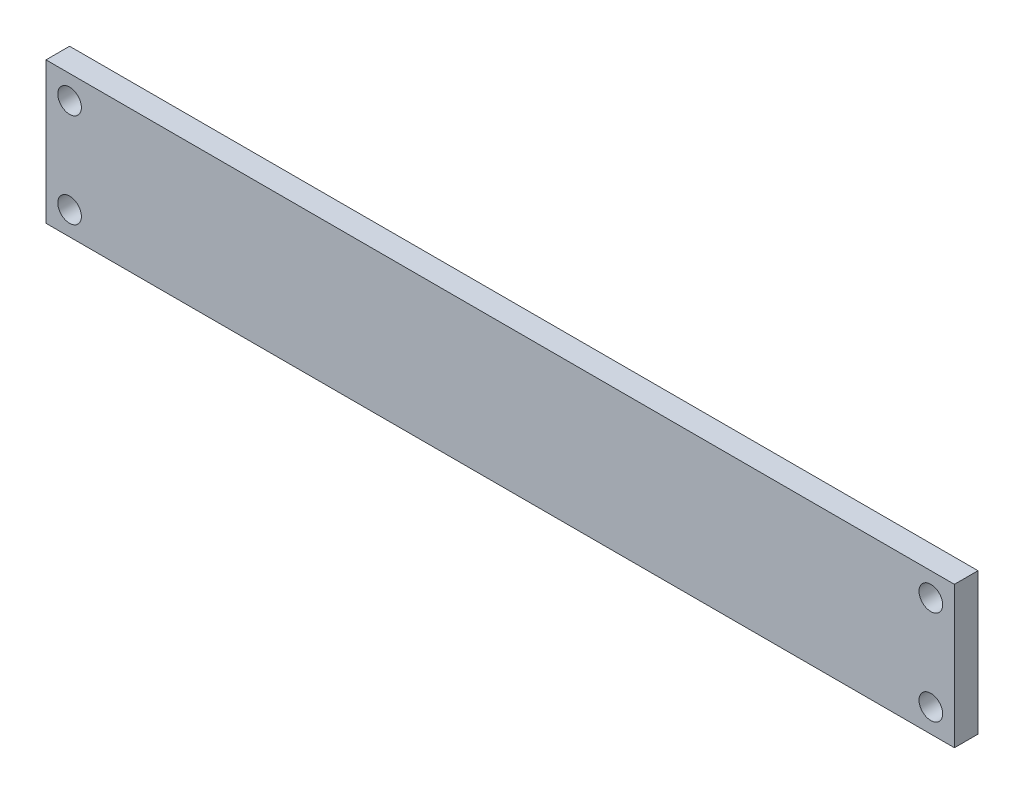
ISO-10303-21;
HEADER;
FILE_DESCRIPTION(('STEP AP214'),'2;1');
FILE_NAME('part.step','',(''),(''),'','','');
FILE_SCHEMA(('AUTOMOTIVE_DESIGN { 1 0 10303 214 1 1 1 1 }'));
ENDSEC;
DATA;
#1=APPLICATION_CONTEXT('core data for automotive mechanical design processes');
#2=APPLICATION_PROTOCOL_DEFINITION('international standard','automotive_design',2000,#1);
#3=PRODUCT_CONTEXT('',#1,'mechanical');
#4=PRODUCT('Part','Part','',(#3));
#5=PRODUCT_RELATED_PRODUCT_CATEGORY('part','',(#4));
#6=PRODUCT_DEFINITION_FORMATION('','',#4);
#7=PRODUCT_DEFINITION_CONTEXT('part definition',#1,'design');
#8=PRODUCT_DEFINITION('design','',#6,#7);
#9=PRODUCT_DEFINITION_SHAPE('','',#8);
#10=(LENGTH_UNIT() NAMED_UNIT(*) SI_UNIT(.MILLI.,.METRE.));
#11=(NAMED_UNIT(*) PLANE_ANGLE_UNIT() SI_UNIT($,.RADIAN.));
#12=(NAMED_UNIT(*) SI_UNIT($,.STERADIAN.) SOLID_ANGLE_UNIT());
#13=UNCERTAINTY_MEASURE_WITH_UNIT(LENGTH_MEASURE(1.E-05),#10,'distance_accuracy_value','');
#14=(GEOMETRIC_REPRESENTATION_CONTEXT(3) GLOBAL_UNCERTAINTY_ASSIGNED_CONTEXT((#13)) GLOBAL_UNIT_ASSIGNED_CONTEXT((#10,
#11,#12)) REPRESENTATION_CONTEXT('',''));
#15=CARTESIAN_POINT('',(0.,0.,0.));
#16=DIRECTION('',(0.,0.,1.));
#17=DIRECTION('',(1.,0.,0.));
#18=AXIS2_PLACEMENT_3D('',#15,#16,#17);
#19=CARTESIAN_POINT('',(0.,0.,10.));
#20=DIRECTION('',(0.,0.,1.));
#21=DIRECTION('',(1.,0.,0.));
#22=AXIS2_PLACEMENT_3D('',#19,#20,#21);
#23=PLANE('',#22);
#24=CARTESIAN_POINT('',(182.5,-20.,10.));
#25=DIRECTION('',(0.,0.,1.));
#26=DIRECTION('',(1.,0.,0.));
#27=AXIS2_PLACEMENT_3D('',#24,#25,#26);
#28=CIRCLE('',#27,5.00000000000002);
#29=CARTESIAN_POINT('',(187.5,-20.,10.));
#30=VERTEX_POINT('',#29);
#31=EDGE_CURVE('E150',#30,#30,#28,.T.);
#32=ORIENTED_EDGE('',*,*,#31,.F.);
#33=EDGE_LOOP('',(#32));
#34=FACE_BOUND('',#33,.T.);
#35=CARTESIAN_POINT('',(-182.5,20.,10.));
#36=DIRECTION('',(0.,0.,1.));
#37=DIRECTION('',(1.,0.,0.));
#38=AXIS2_PLACEMENT_3D('',#35,#36,#37);
#39=CIRCLE('',#38,5.00000000000002);
#40=CARTESIAN_POINT('',(-177.5,20.,10.));
#41=VERTEX_POINT('',#40);
#42=EDGE_CURVE('E117',#41,#41,#39,.T.);
#43=ORIENTED_EDGE('',*,*,#42,.F.);
#44=EDGE_LOOP('',(#43));
#45=FACE_BOUND('',#44,.T.);
#46=DIRECTION('',(0.,1.,0.));
#47=VECTOR('',#46,1.);
#48=CARTESIAN_POINT('',(192.5,30.,10.));
#49=LINE('',#48,#47);
#50=CARTESIAN_POINT('',(192.5,-30.,10.));
#51=VERTEX_POINT('',#50);
#52=CARTESIAN_POINT('',(192.5,30.,10.));
#53=VERTEX_POINT('',#52);
#54=EDGE_CURVE('E96',#51,#53,#49,.T.);
#55=ORIENTED_EDGE('',*,*,#54,.T.);
#56=DIRECTION('',(-1.,0.,0.));
#57=VECTOR('',#56,1.);
#58=CARTESIAN_POINT('',(-192.5,30.,10.));
#59=LINE('',#58,#57);
#60=CARTESIAN_POINT('',(-192.5,30.,10.));
#61=VERTEX_POINT('',#60);
#62=EDGE_CURVE('E91',#53,#61,#59,.T.);
#63=ORIENTED_EDGE('',*,*,#62,.T.);
#64=DIRECTION('',(0.,-1.,0.));
#65=VECTOR('',#64,1.);
#66=CARTESIAN_POINT('',(-192.5,30.,10.));
#67=LINE('',#66,#65);
#68=CARTESIAN_POINT('',(-192.5,-30.,10.));
#69=VERTEX_POINT('',#68);
#70=EDGE_CURVE('E94',#61,#69,#67,.T.);
#71=ORIENTED_EDGE('',*,*,#70,.T.);
#72=DIRECTION('',(1.,0.,0.));
#73=VECTOR('',#72,1.);
#74=CARTESIAN_POINT('',(-192.5,-30.,10.));
#75=LINE('',#74,#73);
#76=EDGE_CURVE('E61',#69,#51,#75,.T.);
#77=ORIENTED_EDGE('',*,*,#76,.T.);
#78=EDGE_LOOP('',(#55,#63,#71,#77));
#79=FACE_BOUND('',#78,.T.);
#80=CARTESIAN_POINT('',(182.5,20.,10.));
#81=DIRECTION('',(0.,0.,1.));
#82=DIRECTION('',(1.,0.,0.));
#83=AXIS2_PLACEMENT_3D('',#80,#81,#82);
#84=CIRCLE('',#83,5.00000000000002);
#85=CARTESIAN_POINT('',(187.5,20.,10.));
#86=VERTEX_POINT('',#85);
#87=EDGE_CURVE('E142',#86,#86,#84,.T.);
#88=ORIENTED_EDGE('',*,*,#87,.F.);
#89=EDGE_LOOP('',(#88));
#90=FACE_BOUND('',#89,.T.);
#91=CARTESIAN_POINT('',(-182.5,-20.,10.));
#92=DIRECTION('',(0.,0.,1.));
#93=DIRECTION('',(1.,0.,0.));
#94=AXIS2_PLACEMENT_3D('',#91,#92,#93);
#95=CIRCLE('',#94,5.00000000000002);
#96=CARTESIAN_POINT('',(-177.5,-20.,10.));
#97=VERTEX_POINT('',#96);
#98=EDGE_CURVE('E158',#97,#97,#95,.T.);
#99=ORIENTED_EDGE('',*,*,#98,.F.);
#100=EDGE_LOOP('',(#99));
#101=FACE_BOUND('',#100,.T.);
#102=ADVANCED_FACE('F43',(#34,#45,#79,#90,#101),#23,.T.);
#103=CARTESIAN_POINT('',(0.,0.,0.));
#104=DIRECTION('',(0.,0.,1.));
#105=DIRECTION('',(1.,0.,0.));
#106=AXIS2_PLACEMENT_3D('',#103,#104,#105);
#107=PLANE('',#106);
#108=DIRECTION('',(0.,1.,0.));
#109=VECTOR('',#108,1.);
#110=CARTESIAN_POINT('',(192.5,30.,0.));
#111=LINE('',#110,#109);
#112=CARTESIAN_POINT('',(192.5,-30.,0.));
#113=VERTEX_POINT('',#112);
#114=CARTESIAN_POINT('',(192.5,30.,0.));
#115=VERTEX_POINT('',#114);
#116=EDGE_CURVE('E113',#113,#115,#111,.T.);
#117=ORIENTED_EDGE('',*,*,#116,.F.);
#118=DIRECTION('',(1.,0.,0.));
#119=VECTOR('',#118,1.);
#120=CARTESIAN_POINT('',(-192.5,-30.,0.));
#121=LINE('',#120,#119);
#122=CARTESIAN_POINT('',(-192.5,-30.,0.));
#123=VERTEX_POINT('',#122);
#124=EDGE_CURVE('E84',#123,#113,#121,.T.);
#125=ORIENTED_EDGE('',*,*,#124,.F.);
#126=DIRECTION('',(0.,-1.,0.));
#127=VECTOR('',#126,1.);
#128=CARTESIAN_POINT('',(-192.5,30.,0.));
#129=LINE('',#128,#127);
#130=CARTESIAN_POINT('',(-192.5,30.,0.));
#131=VERTEX_POINT('',#130);
#132=EDGE_CURVE('E78',#131,#123,#129,.T.);
#133=ORIENTED_EDGE('',*,*,#132,.F.);
#134=DIRECTION('',(-1.,0.,0.));
#135=VECTOR('',#134,1.);
#136=CARTESIAN_POINT('',(-192.5,30.,0.));
#137=LINE('',#136,#135);
#138=EDGE_CURVE('E101',#115,#131,#137,.T.);
#139=ORIENTED_EDGE('',*,*,#138,.F.);
#140=EDGE_LOOP('',(#117,#125,#133,#139));
#141=FACE_BOUND('',#140,.T.);
#142=CARTESIAN_POINT('',(-182.5,20.,0.));
#143=DIRECTION('',(0.,0.,1.));
#144=DIRECTION('',(1.,0.,0.));
#145=AXIS2_PLACEMENT_3D('',#142,#143,#144);
#146=CIRCLE('',#145,5.00000000000002);
#147=CARTESIAN_POINT('',(-177.5,20.,0.));
#148=VERTEX_POINT('',#147);
#149=EDGE_CURVE('E138',#148,#148,#146,.T.);
#150=ORIENTED_EDGE('',*,*,#149,.T.);
#151=EDGE_LOOP('',(#150));
#152=FACE_BOUND('',#151,.T.);
#153=CARTESIAN_POINT('',(182.5,20.,0.));
#154=DIRECTION('',(0.,0.,1.));
#155=DIRECTION('',(1.,0.,0.));
#156=AXIS2_PLACEMENT_3D('',#153,#154,#155);
#157=CIRCLE('',#156,5.00000000000002);
#158=CARTESIAN_POINT('',(187.5,20.,0.));
#159=VERTEX_POINT('',#158);
#160=EDGE_CURVE('E146',#159,#159,#157,.T.);
#161=ORIENTED_EDGE('',*,*,#160,.T.);
#162=EDGE_LOOP('',(#161));
#163=FACE_BOUND('',#162,.T.);
#164=CARTESIAN_POINT('',(182.5,-20.,0.));
#165=DIRECTION('',(0.,0.,1.));
#166=DIRECTION('',(1.,0.,0.));
#167=AXIS2_PLACEMENT_3D('',#164,#165,#166);
#168=CIRCLE('',#167,5.00000000000002);
#169=CARTESIAN_POINT('',(187.5,-20.,0.));
#170=VERTEX_POINT('',#169);
#171=EDGE_CURVE('E154',#170,#170,#168,.T.);
#172=ORIENTED_EDGE('',*,*,#171,.T.);
#173=EDGE_LOOP('',(#172));
#174=FACE_BOUND('',#173,.T.);
#175=CARTESIAN_POINT('',(-182.5,-20.,0.));
#176=DIRECTION('',(0.,0.,1.));
#177=DIRECTION('',(1.,0.,0.));
#178=AXIS2_PLACEMENT_3D('',#175,#176,#177);
#179=CIRCLE('',#178,5.00000000000002);
#180=CARTESIAN_POINT('',(-177.5,-20.,0.));
#181=VERTEX_POINT('',#180);
#182=EDGE_CURVE('E162',#181,#181,#179,.T.);
#183=ORIENTED_EDGE('',*,*,#182,.T.);
#184=EDGE_LOOP('',(#183));
#185=FACE_BOUND('',#184,.T.);
#186=ADVANCED_FACE('F132',(#141,#152,#163,#174,#185),#107,.F.);
#187=CARTESIAN_POINT('',(192.5,30.,10.));
#188=DIRECTION('',(-1.,0.,0.));
#189=DIRECTION('',(0.,0.,1.));
#190=AXIS2_PLACEMENT_3D('',#187,#188,#189);
#191=PLANE('',#190);
#192=ORIENTED_EDGE('',*,*,#116,.T.);
#193=DIRECTION('',(0.,0.,-1.));
#194=VECTOR('',#193,1.);
#195=CARTESIAN_POINT('',(192.5,30.,10.));
#196=LINE('',#195,#194);
#197=EDGE_CURVE('E11',#53,#115,#196,.T.);
#198=ORIENTED_EDGE('',*,*,#197,.F.);
#199=ORIENTED_EDGE('',*,*,#54,.F.);
#200=DIRECTION('',(0.,0.,-1.));
#201=VECTOR('',#200,1.);
#202=CARTESIAN_POINT('',(192.5,-30.,10.));
#203=LINE('',#202,#201);
#204=EDGE_CURVE('E109',#51,#113,#203,.T.);
#205=ORIENTED_EDGE('',*,*,#204,.T.);
#206=EDGE_LOOP('',(#192,#198,#199,#205));
#207=FACE_BOUND('',#206,.T.);
#208=ADVANCED_FACE('F45',(#207),#191,.F.);
#209=CARTESIAN_POINT('',(-192.5,30.,10.));
#210=DIRECTION('',(0.,-1.,0.));
#211=DIRECTION('',(0.,0.,-1.));
#212=AXIS2_PLACEMENT_3D('',#209,#210,#211);
#213=PLANE('',#212);
#214=ORIENTED_EDGE('',*,*,#138,.T.);
#215=DIRECTION('',(0.,0.,-1.));
#216=VECTOR('',#215,1.);
#217=CARTESIAN_POINT('',(-192.5,30.,10.));
#218=LINE('',#217,#216);
#219=EDGE_CURVE('E53',#61,#131,#218,.T.);
#220=ORIENTED_EDGE('',*,*,#219,.F.);
#221=ORIENTED_EDGE('',*,*,#62,.F.);
#222=ORIENTED_EDGE('',*,*,#197,.T.);
#223=EDGE_LOOP('',(#214,#220,#221,#222));
#224=FACE_BOUND('',#223,.T.);
#225=ADVANCED_FACE('F100',(#224),#213,.F.);
#226=CARTESIAN_POINT('',(-192.5,30.,10.));
#227=DIRECTION('',(1.,0.,0.));
#228=DIRECTION('',(0.,0.,-1.));
#229=AXIS2_PLACEMENT_3D('',#226,#227,#228);
#230=PLANE('',#229);
#231=ORIENTED_EDGE('',*,*,#132,.T.);
#232=DIRECTION('',(0.,0.,-1.));
#233=VECTOR('',#232,1.);
#234=CARTESIAN_POINT('',(-192.5,-30.,10.));
#235=LINE('',#234,#233);
#236=EDGE_CURVE('E103',#69,#123,#235,.T.);
#237=ORIENTED_EDGE('',*,*,#236,.F.);
#238=ORIENTED_EDGE('',*,*,#70,.F.);
#239=ORIENTED_EDGE('',*,*,#219,.T.);
#240=EDGE_LOOP('',(#231,#237,#238,#239));
#241=FACE_BOUND('',#240,.T.);
#242=ADVANCED_FACE('F104',(#241),#230,.F.);
#243=CARTESIAN_POINT('',(-192.5,-30.,10.));
#244=DIRECTION('',(0.,1.,0.));
#245=DIRECTION('',(0.,0.,1.));
#246=AXIS2_PLACEMENT_3D('',#243,#244,#245);
#247=PLANE('',#246);
#248=ORIENTED_EDGE('',*,*,#124,.T.);
#249=ORIENTED_EDGE('',*,*,#204,.F.);
#250=ORIENTED_EDGE('',*,*,#76,.F.);
#251=ORIENTED_EDGE('',*,*,#236,.T.);
#252=EDGE_LOOP('',(#248,#249,#250,#251));
#253=FACE_BOUND('',#252,.T.);
#254=ADVANCED_FACE('F129',(#253),#247,.F.);
#255=CARTESIAN_POINT('',(-182.5,20.,10.));
#256=DIRECTION('',(0.,0.,-1.));
#257=DIRECTION('',(-1.,0.,0.));
#258=AXIS2_PLACEMENT_3D('',#255,#256,#257);
#259=CYLINDRICAL_SURFACE('',#258,5.00000000000002);
#260=ORIENTED_EDGE('',*,*,#42,.T.);
#261=EDGE_LOOP('',(#260));
#262=FACE_BOUND('',#261,.T.);
#263=ORIENTED_EDGE('',*,*,#149,.F.);
#264=EDGE_LOOP('',(#263));
#265=FACE_BOUND('',#264,.T.);
#266=ADVANCED_FACE('F183',(#262,#265),#259,.F.);
#267=CARTESIAN_POINT('',(182.5,20.,10.));
#268=DIRECTION('',(0.,0.,-1.));
#269=DIRECTION('',(-1.,0.,0.));
#270=AXIS2_PLACEMENT_3D('',#267,#268,#269);
#271=CYLINDRICAL_SURFACE('',#270,5.00000000000002);
#272=ORIENTED_EDGE('',*,*,#87,.T.);
#273=EDGE_LOOP('',(#272));
#274=FACE_BOUND('',#273,.T.);
#275=ORIENTED_EDGE('',*,*,#160,.F.);
#276=EDGE_LOOP('',(#275));
#277=FACE_BOUND('',#276,.T.);
#278=ADVANCED_FACE('F235',(#274,#277),#271,.F.);
#279=CARTESIAN_POINT('',(182.5,-20.,10.));
#280=DIRECTION('',(0.,0.,-1.));
#281=DIRECTION('',(-1.,0.,0.));
#282=AXIS2_PLACEMENT_3D('',#279,#280,#281);
#283=CYLINDRICAL_SURFACE('',#282,5.00000000000002);
#284=ORIENTED_EDGE('',*,*,#31,.T.);
#285=EDGE_LOOP('',(#284));
#286=FACE_BOUND('',#285,.T.);
#287=ORIENTED_EDGE('',*,*,#171,.F.);
#288=EDGE_LOOP('',(#287));
#289=FACE_BOUND('',#288,.T.);
#290=ADVANCED_FACE('F244',(#286,#289),#283,.F.);
#291=CARTESIAN_POINT('',(-182.5,-20.,10.));
#292=DIRECTION('',(0.,0.,-1.));
#293=DIRECTION('',(-1.,0.,0.));
#294=AXIS2_PLACEMENT_3D('',#291,#292,#293);
#295=CYLINDRICAL_SURFACE('',#294,5.00000000000002);
#296=ORIENTED_EDGE('',*,*,#98,.T.);
#297=EDGE_LOOP('',(#296));
#298=FACE_BOUND('',#297,.T.);
#299=ORIENTED_EDGE('',*,*,#182,.F.);
#300=EDGE_LOOP('',(#299));
#301=FACE_BOUND('',#300,.T.);
#302=ADVANCED_FACE('F170',(#298,#301),#295,.F.);
#303=CLOSED_SHELL('',(#102,#186,#208,#225,#242,#254,#266,#278,#290,#302));
#304=MANIFOLD_SOLID_BREP('B2',#303);
#305=ADVANCED_BREP_SHAPE_REPRESENTATION('',(#18,#304),#14);
#306=SHAPE_DEFINITION_REPRESENTATION(#9,#305);
ENDSEC;
END-ISO-10303-21;
